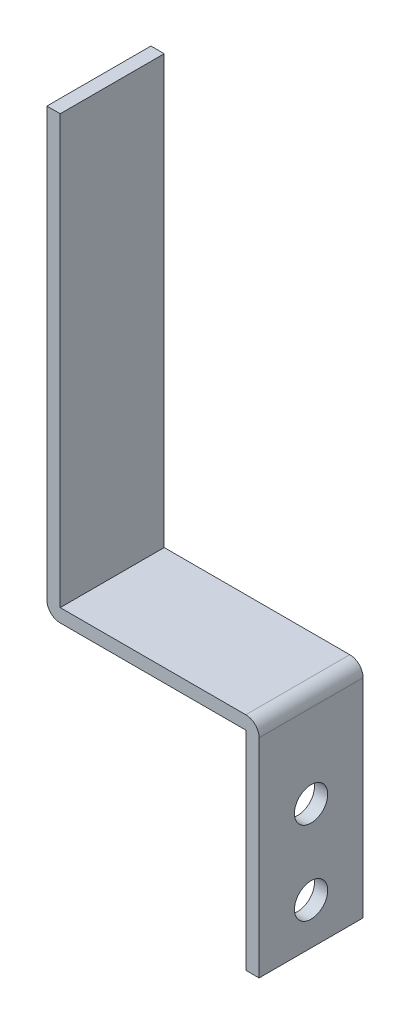
ISO-10303-21;
HEADER;
FILE_DESCRIPTION(('STEP AP214'),'2;1');
FILE_NAME('part.step','',(''),(''),'','','');
FILE_SCHEMA(('AUTOMOTIVE_DESIGN { 1 0 10303 214 1 1 1 1 }'));
ENDSEC;
DATA;
#1=APPLICATION_CONTEXT('core data for automotive mechanical design processes');
#2=APPLICATION_PROTOCOL_DEFINITION('international standard','automotive_design',2000,#1);
#3=PRODUCT_CONTEXT('',#1,'mechanical');
#4=PRODUCT('Part','Part','',(#3));
#5=PRODUCT_RELATED_PRODUCT_CATEGORY('part','',(#4));
#6=PRODUCT_DEFINITION_FORMATION('','',#4);
#7=PRODUCT_DEFINITION_CONTEXT('part definition',#1,'design');
#8=PRODUCT_DEFINITION('design','',#6,#7);
#9=PRODUCT_DEFINITION_SHAPE('','',#8);
#10=(LENGTH_UNIT() NAMED_UNIT(*) SI_UNIT(.MILLI.,.METRE.));
#11=(NAMED_UNIT(*) PLANE_ANGLE_UNIT() SI_UNIT($,.RADIAN.));
#12=(NAMED_UNIT(*) SI_UNIT($,.STERADIAN.) SOLID_ANGLE_UNIT());
#13=UNCERTAINTY_MEASURE_WITH_UNIT(LENGTH_MEASURE(1.E-05),#10,'distance_accuracy_value','');
#14=(GEOMETRIC_REPRESENTATION_CONTEXT(3) GLOBAL_UNCERTAINTY_ASSIGNED_CONTEXT((#13)) GLOBAL_UNIT_ASSIGNED_CONTEXT((#10,
#11,#12)) REPRESENTATION_CONTEXT('',''));
#15=CARTESIAN_POINT('',(0.,0.,0.));
#16=DIRECTION('',(0.,0.,1.));
#17=DIRECTION('',(1.,0.,0.));
#18=AXIS2_PLACEMENT_3D('',#15,#16,#17);
#19=CARTESIAN_POINT('',(3.2,156.,25.));
#20=DIRECTION('',(0.,-1.,0.));
#21=DIRECTION('',(0.,0.,-1.));
#22=AXIS2_PLACEMENT_3D('',#19,#20,#21);
#23=PLANE('',#22);
#24=DIRECTION('',(-1.,0.,0.));
#25=VECTOR('',#24,1.);
#26=CARTESIAN_POINT('',(3.2,156.,0.));
#27=LINE('',#26,#25);
#28=CARTESIAN_POINT('',(3.2,156.,0.));
#29=VERTEX_POINT('',#28);
#30=CARTESIAN_POINT('',(0.,156.,0.));
#31=VERTEX_POINT('',#30);
#32=EDGE_CURVE('E147',#29,#31,#27,.T.);
#33=ORIENTED_EDGE('',*,*,#32,.T.);
#34=DIRECTION('',(0.,0.,-1.));
#35=VECTOR('',#34,1.);
#36=CARTESIAN_POINT('',(0.,156.,25.));
#37=LINE('',#36,#35);
#38=CARTESIAN_POINT('',(0.,156.,25.));
#39=VERTEX_POINT('',#38);
#40=EDGE_CURVE('E11',#39,#31,#37,.T.);
#41=ORIENTED_EDGE('',*,*,#40,.F.);
#42=DIRECTION('',(-1.,0.,0.));
#43=VECTOR('',#42,1.);
#44=CARTESIAN_POINT('',(3.2,156.,25.));
#45=LINE('',#44,#43);
#46=CARTESIAN_POINT('',(3.2,156.,25.));
#47=VERTEX_POINT('',#46);
#48=EDGE_CURVE('E166',#47,#39,#45,.T.);
#49=ORIENTED_EDGE('',*,*,#48,.F.);
#50=DIRECTION('',(0.,0.,-1.));
#51=VECTOR('',#50,1.);
#52=CARTESIAN_POINT('',(3.2,156.,25.));
#53=LINE('',#52,#51);
#54=EDGE_CURVE('E143',#47,#29,#53,.T.);
#55=ORIENTED_EDGE('',*,*,#54,.T.);
#56=EDGE_LOOP('',(#33,#41,#49,#55));
#57=FACE_BOUND('',#56,.T.);
#58=ADVANCED_FACE('F39',(#57),#23,.F.);
#59=CARTESIAN_POINT('',(0.,156.,25.));
#60=DIRECTION('',(1.,0.,0.));
#61=DIRECTION('',(0.,0.,-1.));
#62=AXIS2_PLACEMENT_3D('',#59,#60,#61);
#63=PLANE('',#62);
#64=DIRECTION('',(0.,-1.,0.));
#65=VECTOR('',#64,1.);
#66=CARTESIAN_POINT('',(0.,156.,0.));
#67=LINE('',#66,#65);
#68=CARTESIAN_POINT('',(0.,53.2,0.));
#69=VERTEX_POINT('',#68);
#70=EDGE_CURVE('E150',#31,#69,#67,.T.);
#71=ORIENTED_EDGE('',*,*,#70,.T.);
#72=DIRECTION('',(0.,0.,-1.));
#73=VECTOR('',#72,1.);
#74=CARTESIAN_POINT('',(0.,53.2,25.));
#75=LINE('',#74,#73);
#76=CARTESIAN_POINT('',(0.,53.2,25.));
#77=VERTEX_POINT('',#76);
#78=EDGE_CURVE('E47',#77,#69,#75,.T.);
#79=ORIENTED_EDGE('',*,*,#78,.F.);
#80=DIRECTION('',(0.,-1.,0.));
#81=VECTOR('',#80,1.);
#82=CARTESIAN_POINT('',(0.,156.,25.));
#83=LINE('',#82,#81);
#84=EDGE_CURVE('E104',#39,#77,#83,.T.);
#85=ORIENTED_EDGE('',*,*,#84,.F.);
#86=ORIENTED_EDGE('',*,*,#40,.T.);
#87=EDGE_LOOP('',(#71,#79,#85,#86));
#88=FACE_BOUND('',#87,.T.);
#89=ADVANCED_FACE('F251',(#88),#63,.F.);
#90=CARTESIAN_POINT('',(3.2,53.2,25.));
#91=DIRECTION('',(0.,0.,-1.));
#92=DIRECTION('',(-1.,0.,0.));
#93=AXIS2_PLACEMENT_3D('',#90,#91,#92);
#94=CYLINDRICAL_SURFACE('',#93,3.2);
#95=CARTESIAN_POINT('',(3.2,53.2,0.));
#96=DIRECTION('',(0.,0.,1.));
#97=DIRECTION('',(1.,0.,0.));
#98=AXIS2_PLACEMENT_3D('',#95,#96,#97);
#99=CIRCLE('',#98,3.2);
#100=CARTESIAN_POINT('',(3.20000000000002,50.,0.));
#101=VERTEX_POINT('',#100);
#102=EDGE_CURVE('E153',#69,#101,#99,.T.);
#103=ORIENTED_EDGE('',*,*,#102,.T.);
#104=DIRECTION('',(0.,0.,-1.));
#105=VECTOR('',#104,1.);
#106=CARTESIAN_POINT('',(3.20000000000002,50.,25.));
#107=LINE('',#106,#105);
#108=CARTESIAN_POINT('',(3.20000000000002,50.,25.));
#109=VERTEX_POINT('',#108);
#110=EDGE_CURVE('E179',#109,#101,#107,.T.);
#111=ORIENTED_EDGE('',*,*,#110,.F.);
#112=CARTESIAN_POINT('',(3.2,53.2,25.));
#113=DIRECTION('',(0.,0.,1.));
#114=DIRECTION('',(1.,0.,0.));
#115=AXIS2_PLACEMENT_3D('',#112,#113,#114);
#116=CIRCLE('',#115,3.2);
#117=EDGE_CURVE('E187',#77,#109,#116,.T.);
#118=ORIENTED_EDGE('',*,*,#117,.F.);
#119=ORIENTED_EDGE('',*,*,#78,.T.);
#120=EDGE_LOOP('',(#103,#111,#118,#119));
#121=FACE_BOUND('',#120,.T.);
#122=ADVANCED_FACE('F185',(#121),#94,.T.);
#123=CARTESIAN_POINT('',(3.20000000000002,50.,25.));
#124=DIRECTION('',(0.,1.,0.));
#125=DIRECTION('',(0.,0.,1.));
#126=AXIS2_PLACEMENT_3D('',#123,#124,#125);
#127=PLANE('',#126);
#128=DIRECTION('',(1.,0.,0.));
#129=VECTOR('',#128,1.);
#130=CARTESIAN_POINT('',(3.20000000000002,50.,0.));
#131=LINE('',#130,#129);
#132=CARTESIAN_POINT('',(47.8,50.,0.));
#133=VERTEX_POINT('',#132);
#134=EDGE_CURVE('E155',#101,#133,#131,.T.);
#135=ORIENTED_EDGE('',*,*,#134,.T.);
#136=DIRECTION('',(0.,0.,-1.));
#137=VECTOR('',#136,1.);
#138=CARTESIAN_POINT('',(47.8,50.,25.));
#139=LINE('',#138,#137);
#140=CARTESIAN_POINT('',(47.8,50.,25.));
#141=VERTEX_POINT('',#140);
#142=EDGE_CURVE('E176',#141,#133,#139,.T.);
#143=ORIENTED_EDGE('',*,*,#142,.F.);
#144=DIRECTION('',(1.,0.,0.));
#145=VECTOR('',#144,1.);
#146=CARTESIAN_POINT('',(3.20000000000002,50.,25.));
#147=LINE('',#146,#145);
#148=EDGE_CURVE('E205',#109,#141,#147,.T.);
#149=ORIENTED_EDGE('',*,*,#148,.F.);
#150=ORIENTED_EDGE('',*,*,#110,.T.);
#151=EDGE_LOOP('',(#135,#143,#149,#150));
#152=FACE_BOUND('',#151,.T.);
#153=ADVANCED_FACE('F196',(#152),#127,.F.);
#154=CARTESIAN_POINT('',(47.8,50.,25.));
#155=DIRECTION('',(1.,0.,0.));
#156=DIRECTION('',(0.,0.,-1.));
#157=AXIS2_PLACEMENT_3D('',#154,#155,#156);
#158=PLANE('',#157);
#159=CARTESIAN_POINT('',(47.8,10.,12.5));
#160=DIRECTION('',(1.,0.,0.));
#161=DIRECTION('',(0.,0.,-1.));
#162=AXIS2_PLACEMENT_3D('',#159,#160,#161);
#163=CIRCLE('',#162,4.);
#164=CARTESIAN_POINT('',(47.8,10.,8.5));
#165=VERTEX_POINT('',#164);
#166=EDGE_CURVE('E151',#165,#165,#163,.T.);
#167=ORIENTED_EDGE('',*,*,#166,.T.);
#168=EDGE_LOOP('',(#167));
#169=FACE_BOUND('',#168,.T.);
#170=CARTESIAN_POINT('',(47.8,30.,12.5));
#171=DIRECTION('',(1.,0.,0.));
#172=DIRECTION('',(0.,0.,-1.));
#173=AXIS2_PLACEMENT_3D('',#170,#171,#172);
#174=CIRCLE('',#173,4.);
#175=CARTESIAN_POINT('',(47.8,30.,8.5));
#176=VERTEX_POINT('',#175);
#177=EDGE_CURVE('E215',#176,#176,#174,.T.);
#178=ORIENTED_EDGE('',*,*,#177,.T.);
#179=EDGE_LOOP('',(#178));
#180=FACE_BOUND('',#179,.T.);
#181=DIRECTION('',(0.,-1.,0.));
#182=VECTOR('',#181,1.);
#183=CARTESIAN_POINT('',(47.8,50.,0.));
#184=LINE('',#183,#182);
#185=CARTESIAN_POINT('',(47.8,0.,0.));
#186=VERTEX_POINT('',#185);
#187=EDGE_CURVE('E157',#133,#186,#184,.T.);
#188=ORIENTED_EDGE('',*,*,#187,.T.);
#189=DIRECTION('',(0.,0.,-1.));
#190=VECTOR('',#189,1.);
#191=CARTESIAN_POINT('',(47.8,0.,25.));
#192=LINE('',#191,#190);
#193=CARTESIAN_POINT('',(47.8,0.,25.));
#194=VERTEX_POINT('',#193);
#195=EDGE_CURVE('E173',#194,#186,#192,.T.);
#196=ORIENTED_EDGE('',*,*,#195,.F.);
#197=DIRECTION('',(0.,-1.,0.));
#198=VECTOR('',#197,1.);
#199=CARTESIAN_POINT('',(47.8,50.,25.));
#200=LINE('',#199,#198);
#201=EDGE_CURVE('E202',#141,#194,#200,.T.);
#202=ORIENTED_EDGE('',*,*,#201,.F.);
#203=ORIENTED_EDGE('',*,*,#142,.T.);
#204=EDGE_LOOP('',(#188,#196,#202,#203));
#205=FACE_BOUND('',#204,.T.);
#206=ADVANCED_FACE('F200',(#169,#180,#205),#158,.F.);
#207=CARTESIAN_POINT('',(47.8,0.,25.));
#208=DIRECTION('',(0.,1.,0.));
#209=DIRECTION('',(0.,0.,1.));
#210=AXIS2_PLACEMENT_3D('',#207,#208,#209);
#211=PLANE('',#210);
#212=DIRECTION('',(1.,0.,0.));
#213=VECTOR('',#212,1.);
#214=CARTESIAN_POINT('',(47.8,0.,0.));
#215=LINE('',#214,#213);
#216=CARTESIAN_POINT('',(51.,0.,0.));
#217=VERTEX_POINT('',#216);
#218=EDGE_CURVE('E159',#186,#217,#215,.T.);
#219=ORIENTED_EDGE('',*,*,#218,.T.);
#220=DIRECTION('',(0.,0.,-1.));
#221=VECTOR('',#220,1.);
#222=CARTESIAN_POINT('',(51.,0.,25.));
#223=LINE('',#222,#221);
#224=CARTESIAN_POINT('',(51.,0.,25.));
#225=VERTEX_POINT('',#224);
#226=EDGE_CURVE('E170',#225,#217,#223,.T.);
#227=ORIENTED_EDGE('',*,*,#226,.F.);
#228=DIRECTION('',(1.,0.,0.));
#229=VECTOR('',#228,1.);
#230=CARTESIAN_POINT('',(47.8,0.,25.));
#231=LINE('',#230,#229);
#232=EDGE_CURVE('E204',#194,#225,#231,.T.);
#233=ORIENTED_EDGE('',*,*,#232,.F.);
#234=ORIENTED_EDGE('',*,*,#195,.T.);
#235=EDGE_LOOP('',(#219,#227,#233,#234));
#236=FACE_BOUND('',#235,.T.);
#237=ADVANCED_FACE('F231',(#236),#211,.F.);
#238=CARTESIAN_POINT('',(51.,0.,25.));
#239=DIRECTION('',(-1.,0.,0.));
#240=DIRECTION('',(0.,0.,1.));
#241=AXIS2_PLACEMENT_3D('',#238,#239,#240);
#242=PLANE('',#241);
#243=CARTESIAN_POINT('',(51.,10.,12.5));
#244=DIRECTION('',(1.,0.,0.));
#245=DIRECTION('',(0.,0.,-1.));
#246=AXIS2_PLACEMENT_3D('',#243,#244,#245);
#247=CIRCLE('',#246,4.);
#248=CARTESIAN_POINT('',(51.,10.,8.5));
#249=VERTEX_POINT('',#248);
#250=EDGE_CURVE('E218',#249,#249,#247,.T.);
#251=ORIENTED_EDGE('',*,*,#250,.F.);
#252=EDGE_LOOP('',(#251));
#253=FACE_BOUND('',#252,.T.);
#254=CARTESIAN_POINT('',(51.,30.,12.5));
#255=DIRECTION('',(1.,0.,0.));
#256=DIRECTION('',(0.,0.,-1.));
#257=AXIS2_PLACEMENT_3D('',#254,#255,#256);
#258=CIRCLE('',#257,4.);
#259=CARTESIAN_POINT('',(51.,30.,8.5));
#260=VERTEX_POINT('',#259);
#261=EDGE_CURVE('E219',#260,#260,#258,.T.);
#262=ORIENTED_EDGE('',*,*,#261,.F.);
#263=EDGE_LOOP('',(#262));
#264=FACE_BOUND('',#263,.T.);
#265=DIRECTION('',(0.,1.,0.));
#266=VECTOR('',#265,1.);
#267=CARTESIAN_POINT('',(51.,0.,0.));
#268=LINE('',#267,#266);
#269=CARTESIAN_POINT('',(51.,50.,0.));
#270=VERTEX_POINT('',#269);
#271=EDGE_CURVE('E161',#217,#270,#268,.T.);
#272=ORIENTED_EDGE('',*,*,#271,.T.);
#273=DIRECTION('',(0.,0.,-1.));
#274=VECTOR('',#273,1.);
#275=CARTESIAN_POINT('',(51.,50.,25.));
#276=LINE('',#275,#274);
#277=CARTESIAN_POINT('',(51.,50.,25.));
#278=VERTEX_POINT('',#277);
#279=EDGE_CURVE('E138',#278,#270,#276,.T.);
#280=ORIENTED_EDGE('',*,*,#279,.F.);
#281=DIRECTION('',(0.,1.,0.));
#282=VECTOR('',#281,1.);
#283=CARTESIAN_POINT('',(51.,0.,25.));
#284=LINE('',#283,#282);
#285=EDGE_CURVE('E129',#225,#278,#284,.T.);
#286=ORIENTED_EDGE('',*,*,#285,.F.);
#287=ORIENTED_EDGE('',*,*,#226,.T.);
#288=EDGE_LOOP('',(#272,#280,#286,#287));
#289=FACE_BOUND('',#288,.T.);
#290=ADVANCED_FACE('F228',(#253,#264,#289),#242,.F.);
#291=CARTESIAN_POINT('',(47.8,50.,25.));
#292=DIRECTION('',(0.,0.,-1.));
#293=DIRECTION('',(-1.,0.,0.));
#294=AXIS2_PLACEMENT_3D('',#291,#292,#293);
#295=CYLINDRICAL_SURFACE('',#294,3.2);
#296=CARTESIAN_POINT('',(47.8,50.,0.));
#297=DIRECTION('',(0.,0.,1.));
#298=DIRECTION('',(1.,0.,0.));
#299=AXIS2_PLACEMENT_3D('',#296,#297,#298);
#300=CIRCLE('',#299,3.2);
#301=CARTESIAN_POINT('',(47.8,53.2,0.));
#302=VERTEX_POINT('',#301);
#303=EDGE_CURVE('E137',#270,#302,#300,.T.);
#304=ORIENTED_EDGE('',*,*,#303,.T.);
#305=DIRECTION('',(0.,0.,-1.));
#306=VECTOR('',#305,1.);
#307=CARTESIAN_POINT('',(47.8,53.2,25.));
#308=LINE('',#307,#306);
#309=CARTESIAN_POINT('',(47.8,53.2,25.));
#310=VERTEX_POINT('',#309);
#311=EDGE_CURVE('E134',#310,#302,#308,.T.);
#312=ORIENTED_EDGE('',*,*,#311,.F.);
#313=CARTESIAN_POINT('',(47.8,50.,25.));
#314=DIRECTION('',(0.,0.,1.));
#315=DIRECTION('',(1.,0.,0.));
#316=AXIS2_PLACEMENT_3D('',#313,#314,#315);
#317=CIRCLE('',#316,3.2);
#318=EDGE_CURVE('E123',#278,#310,#317,.T.);
#319=ORIENTED_EDGE('',*,*,#318,.F.);
#320=ORIENTED_EDGE('',*,*,#279,.T.);
#321=EDGE_LOOP('',(#304,#312,#319,#320));
#322=FACE_BOUND('',#321,.T.);
#323=ADVANCED_FACE('F135',(#322),#295,.T.);
#324=CARTESIAN_POINT('',(47.8,53.2,25.));
#325=DIRECTION('',(0.,-1.,0.));
#326=DIRECTION('',(0.,0.,-1.));
#327=AXIS2_PLACEMENT_3D('',#324,#325,#326);
#328=PLANE('',#327);
#329=DIRECTION('',(-1.,0.,0.));
#330=VECTOR('',#329,1.);
#331=CARTESIAN_POINT('',(47.8,53.2,0.));
#332=LINE('',#331,#330);
#333=CARTESIAN_POINT('',(3.2,53.2,0.));
#334=VERTEX_POINT('',#333);
#335=EDGE_CURVE('E90',#302,#334,#332,.T.);
#336=ORIENTED_EDGE('',*,*,#335,.T.);
#337=DIRECTION('',(0.,0.,-1.));
#338=VECTOR('',#337,1.);
#339=CARTESIAN_POINT('',(3.2,53.2,25.));
#340=LINE('',#339,#338);
#341=CARTESIAN_POINT('',(3.2,53.2,25.));
#342=VERTEX_POINT('',#341);
#343=EDGE_CURVE('E139',#342,#334,#340,.T.);
#344=ORIENTED_EDGE('',*,*,#343,.F.);
#345=DIRECTION('',(-1.,0.,0.));
#346=VECTOR('',#345,1.);
#347=CARTESIAN_POINT('',(47.8,53.2,25.));
#348=LINE('',#347,#346);
#349=EDGE_CURVE('E127',#310,#342,#348,.T.);
#350=ORIENTED_EDGE('',*,*,#349,.F.);
#351=ORIENTED_EDGE('',*,*,#311,.T.);
#352=EDGE_LOOP('',(#336,#344,#350,#351));
#353=FACE_BOUND('',#352,.T.);
#354=ADVANCED_FACE('F141',(#353),#328,.F.);
#355=CARTESIAN_POINT('',(3.2,53.2,25.));
#356=DIRECTION('',(-1.,0.,0.));
#357=DIRECTION('',(0.,0.,1.));
#358=AXIS2_PLACEMENT_3D('',#355,#356,#357);
#359=PLANE('',#358);
#360=DIRECTION('',(0.,1.,0.));
#361=VECTOR('',#360,1.);
#362=CARTESIAN_POINT('',(3.2,53.2,0.));
#363=LINE('',#362,#361);
#364=EDGE_CURVE('E96',#334,#29,#363,.T.);
#365=ORIENTED_EDGE('',*,*,#364,.T.);
#366=ORIENTED_EDGE('',*,*,#54,.F.);
#367=DIRECTION('',(0.,1.,0.));
#368=VECTOR('',#367,1.);
#369=CARTESIAN_POINT('',(3.2,53.2,25.));
#370=LINE('',#369,#368);
#371=EDGE_CURVE('E55',#342,#47,#370,.T.);
#372=ORIENTED_EDGE('',*,*,#371,.F.);
#373=ORIENTED_EDGE('',*,*,#343,.T.);
#374=EDGE_LOOP('',(#365,#366,#372,#373));
#375=FACE_BOUND('',#374,.T.);
#376=ADVANCED_FACE('F240',(#375),#359,.F.);
#377=CARTESIAN_POINT('',(3.2,53.2,25.));
#378=DIRECTION('',(0.,0.,1.));
#379=DIRECTION('',(1.,0.,0.));
#380=AXIS2_PLACEMENT_3D('',#377,#378,#379);
#381=PLANE('',#380);
#382=ORIENTED_EDGE('',*,*,#48,.T.);
#383=ORIENTED_EDGE('',*,*,#84,.T.);
#384=ORIENTED_EDGE('',*,*,#117,.T.);
#385=ORIENTED_EDGE('',*,*,#148,.T.);
#386=ORIENTED_EDGE('',*,*,#201,.T.);
#387=ORIENTED_EDGE('',*,*,#232,.T.);
#388=ORIENTED_EDGE('',*,*,#285,.T.);
#389=ORIENTED_EDGE('',*,*,#318,.T.);
#390=ORIENTED_EDGE('',*,*,#349,.T.);
#391=ORIENTED_EDGE('',*,*,#371,.T.);
#392=EDGE_LOOP('',(#382,#383,#384,#385,#386,#387,#388,#389,#390,#391));
#393=FACE_BOUND('',#392,.T.);
#394=ADVANCED_FACE('F125',(#393),#381,.T.);
#395=CARTESIAN_POINT('',(3.2,53.2,0.));
#396=DIRECTION('',(0.,0.,1.));
#397=DIRECTION('',(1.,0.,0.));
#398=AXIS2_PLACEMENT_3D('',#395,#396,#397);
#399=PLANE('',#398);
#400=ORIENTED_EDGE('',*,*,#32,.F.);
#401=ORIENTED_EDGE('',*,*,#364,.F.);
#402=ORIENTED_EDGE('',*,*,#335,.F.);
#403=ORIENTED_EDGE('',*,*,#303,.F.);
#404=ORIENTED_EDGE('',*,*,#271,.F.);
#405=ORIENTED_EDGE('',*,*,#218,.F.);
#406=ORIENTED_EDGE('',*,*,#187,.F.);
#407=ORIENTED_EDGE('',*,*,#134,.F.);
#408=ORIENTED_EDGE('',*,*,#102,.F.);
#409=ORIENTED_EDGE('',*,*,#70,.F.);
#410=EDGE_LOOP('',(#400,#401,#402,#403,#404,#405,#406,#407,#408,#409));
#411=FACE_BOUND('',#410,.T.);
#412=ADVANCED_FACE('F191',(#411),#399,.F.);
#413=CARTESIAN_POINT('',(-1.2E-05,30.,12.5));
#414=DIRECTION('',(1.,0.,0.));
#415=DIRECTION('',(0.,0.,-1.));
#416=AXIS2_PLACEMENT_3D('',#413,#414,#415);
#417=CYLINDRICAL_SURFACE('',#416,4.);
#418=CARTESIAN_POINT('',(51.,30.,8.5));
#419=CARTESIAN_POINT('',(50.9666666666667,30.,8.5));
#420=CARTESIAN_POINT('',(50.9333333333333,30.,8.5));
#421=CARTESIAN_POINT('',(50.8666666666667,30.,8.5));
#422=CARTESIAN_POINT('',(50.8333333333333,30.,8.5));
#423=CARTESIAN_POINT('',(50.7666666666667,30.,8.5));
#424=CARTESIAN_POINT('',(50.7333333333333,30.,8.5));
#425=CARTESIAN_POINT('',(50.6666666666667,30.,8.5));
#426=CARTESIAN_POINT('',(50.6333333333333,30.,8.5));
#427=CARTESIAN_POINT('',(50.5666666666667,30.,8.5));
#428=CARTESIAN_POINT('',(50.5333333333333,30.,8.5));
#429=CARTESIAN_POINT('',(50.4666666666667,30.,8.5));
#430=CARTESIAN_POINT('',(50.4333333333333,30.,8.5));
#431=CARTESIAN_POINT('',(50.3666666666667,30.,8.5));
#432=CARTESIAN_POINT('',(50.3333333333333,30.,8.5));
#433=CARTESIAN_POINT('',(50.2666666666667,30.,8.5));
#434=CARTESIAN_POINT('',(50.2333333333333,30.,8.5));
#435=CARTESIAN_POINT('',(50.1666666666667,30.,8.5));
#436=CARTESIAN_POINT('',(50.1333333333333,30.,8.5));
#437=CARTESIAN_POINT('',(50.0666666666667,30.,8.5));
#438=CARTESIAN_POINT('',(50.0333333333333,30.,8.5));
#439=CARTESIAN_POINT('',(49.9666666666667,30.,8.5));
#440=CARTESIAN_POINT('',(49.9333333333333,30.,8.5));
#441=CARTESIAN_POINT('',(49.8666666666667,30.,8.5));
#442=CARTESIAN_POINT('',(49.8333333333333,30.,8.5));
#443=CARTESIAN_POINT('',(49.7666666666667,30.,8.5));
#444=CARTESIAN_POINT('',(49.7333333333333,30.,8.5));
#445=CARTESIAN_POINT('',(49.6666666666667,30.,8.5));
#446=CARTESIAN_POINT('',(49.6333333333333,30.,8.5));
#447=CARTESIAN_POINT('',(49.5666666666667,30.,8.5));
#448=CARTESIAN_POINT('',(49.5333333333333,30.,8.5));
#449=CARTESIAN_POINT('',(49.4666666666667,30.,8.5));
#450=CARTESIAN_POINT('',(49.4333333333333,30.,8.5));
#451=CARTESIAN_POINT('',(49.3666666666667,30.,8.5));
#452=CARTESIAN_POINT('',(49.3333333333333,30.,8.5));
#453=CARTESIAN_POINT('',(49.2666666666667,30.,8.5));
#454=CARTESIAN_POINT('',(49.2333333333333,30.,8.5));
#455=CARTESIAN_POINT('',(49.1666666666667,30.,8.5));
#456=CARTESIAN_POINT('',(49.1333333333333,30.,8.5));
#457=CARTESIAN_POINT('',(49.0666666666667,30.,8.5));
#458=CARTESIAN_POINT('',(49.0333333333333,30.,8.5));
#459=CARTESIAN_POINT('',(48.9666666666667,30.,8.5));
#460=CARTESIAN_POINT('',(48.9333333333333,30.,8.5));
#461=CARTESIAN_POINT('',(48.8666666666667,30.,8.5));
#462=CARTESIAN_POINT('',(48.8333333333333,30.,8.5));
#463=CARTESIAN_POINT('',(48.7666666666667,30.,8.5));
#464=CARTESIAN_POINT('',(48.7333333333333,30.,8.5));
#465=CARTESIAN_POINT('',(48.6666666666667,30.,8.5));
#466=CARTESIAN_POINT('',(48.6333333333333,30.,8.5));
#467=CARTESIAN_POINT('',(48.5666666666667,30.,8.5));
#468=CARTESIAN_POINT('',(48.5333333333333,30.,8.5));
#469=CARTESIAN_POINT('',(48.4666666666667,30.,8.5));
#470=CARTESIAN_POINT('',(48.4333333333333,30.,8.5));
#471=CARTESIAN_POINT('',(48.3666666666667,30.,8.5));
#472=CARTESIAN_POINT('',(48.3333333333333,30.,8.5));
#473=CARTESIAN_POINT('',(48.2666666666667,30.,8.5));
#474=CARTESIAN_POINT('',(48.2333333333333,30.,8.5));
#475=CARTESIAN_POINT('',(48.1666666666667,30.,8.5));
#476=CARTESIAN_POINT('',(48.1333333333333,30.,8.5));
#477=CARTESIAN_POINT('',(48.0666666666667,30.,8.5));
#478=CARTESIAN_POINT('',(48.0333333333333,30.,8.5));
#479=CARTESIAN_POINT('',(47.9666666666667,30.,8.5));
#480=CARTESIAN_POINT('',(47.9333333333333,30.,8.5));
#481=CARTESIAN_POINT('',(47.8666666666667,30.,8.5));
#482=CARTESIAN_POINT('',(47.8333333333333,30.,8.5));
#483=CARTESIAN_POINT('',(47.8,30.,8.5));
#484=B_SPLINE_CURVE_WITH_KNOTS('',3,(#418,#419,#420,#421,#422,#423,#424,#425,#426,#427,#428,
#429,#430,#431,#432,#433,#434,#435,#436,#437,#438,#439,#440,#441,#442,#443,#444,#445,#446,#447,
#448,#449,#450,#451,#452,#453,#454,#455,#456,#457,#458,#459,#460,#461,#462,#463,#464,#465,#466,
#467,#468,#469,#470,#471,#472,#473,#474,#475,#476,#477,#478,#479,#480,#481,#482,#483),
.UNSPECIFIED.,.F.,.F.,(4,2,2,2,2,2,2,2,2,2,2,2,2,2,2,2,2,2,2,2,2,2,2,2,2,2,2,2,2,2,2,2,4),(0.,
0.100000000000003,0.199999999999999,0.300000000000002,0.399999999999998,0.5,0.599999999999996,
0.699999999999999,0.799999999999995,0.899999999999998,1.,1.1,1.2,1.3,1.4,1.49999999999999,1.6,
1.7,1.8,1.9,1.99999999999999,2.1,2.19999999999999,2.3,2.4,2.5,2.6,2.69999999999999,2.8,
2.89999999999999,3.,3.09999999999999,3.19999999999999),.UNSPECIFIED.);
#485=EDGE_CURVE('BSEAM300',#260,#176,#484,.T.);
#486=ORIENTED_EDGE('',*,*,#261,.T.);
#487=ORIENTED_EDGE('',*,*,#177,.F.);
#488=ORIENTED_EDGE('',*,*,#485,.T.);
#489=ORIENTED_EDGE('',*,*,#485,.F.);
#490=EDGE_LOOP('',(#486,#488,#487,#489));
#491=FACE_BOUND('',#490,.T.);
#492=ADVANCED_FACE('F300',(#491),#417,.F.);
#493=CARTESIAN_POINT('',(-1.2E-05,10.,12.5));
#494=DIRECTION('',(1.,0.,0.));
#495=DIRECTION('',(0.,0.,-1.));
#496=AXIS2_PLACEMENT_3D('',#493,#494,#495);
#497=CYLINDRICAL_SURFACE('',#496,4.);
#498=CARTESIAN_POINT('',(51.,10.,8.5));
#499=CARTESIAN_POINT('',(50.9666666666667,10.,8.5));
#500=CARTESIAN_POINT('',(50.9333333333333,10.,8.5));
#501=CARTESIAN_POINT('',(50.8666666666667,10.,8.5));
#502=CARTESIAN_POINT('',(50.8333333333333,10.,8.5));
#503=CARTESIAN_POINT('',(50.7666666666667,10.,8.5));
#504=CARTESIAN_POINT('',(50.7333333333333,10.,8.5));
#505=CARTESIAN_POINT('',(50.6666666666667,10.,8.5));
#506=CARTESIAN_POINT('',(50.6333333333333,10.,8.5));
#507=CARTESIAN_POINT('',(50.5666666666667,10.,8.5));
#508=CARTESIAN_POINT('',(50.5333333333333,10.,8.5));
#509=CARTESIAN_POINT('',(50.4666666666667,10.,8.5));
#510=CARTESIAN_POINT('',(50.4333333333333,10.,8.5));
#511=CARTESIAN_POINT('',(50.3666666666667,10.,8.5));
#512=CARTESIAN_POINT('',(50.3333333333333,10.,8.5));
#513=CARTESIAN_POINT('',(50.2666666666667,10.,8.5));
#514=CARTESIAN_POINT('',(50.2333333333333,10.,8.5));
#515=CARTESIAN_POINT('',(50.1666666666667,10.,8.5));
#516=CARTESIAN_POINT('',(50.1333333333333,10.,8.5));
#517=CARTESIAN_POINT('',(50.0666666666667,10.,8.5));
#518=CARTESIAN_POINT('',(50.0333333333333,10.,8.5));
#519=CARTESIAN_POINT('',(49.9666666666667,10.,8.5));
#520=CARTESIAN_POINT('',(49.9333333333333,10.,8.5));
#521=CARTESIAN_POINT('',(49.8666666666667,10.,8.5));
#522=CARTESIAN_POINT('',(49.8333333333333,10.,8.5));
#523=CARTESIAN_POINT('',(49.7666666666667,10.,8.5));
#524=CARTESIAN_POINT('',(49.7333333333333,10.,8.5));
#525=CARTESIAN_POINT('',(49.6666666666667,10.,8.5));
#526=CARTESIAN_POINT('',(49.6333333333333,10.,8.5));
#527=CARTESIAN_POINT('',(49.5666666666667,10.,8.5));
#528=CARTESIAN_POINT('',(49.5333333333333,10.,8.5));
#529=CARTESIAN_POINT('',(49.4666666666667,10.,8.5));
#530=CARTESIAN_POINT('',(49.4333333333333,10.,8.5));
#531=CARTESIAN_POINT('',(49.3666666666667,10.,8.5));
#532=CARTESIAN_POINT('',(49.3333333333333,10.,8.5));
#533=CARTESIAN_POINT('',(49.2666666666667,10.,8.5));
#534=CARTESIAN_POINT('',(49.2333333333333,10.,8.5));
#535=CARTESIAN_POINT('',(49.1666666666667,10.,8.5));
#536=CARTESIAN_POINT('',(49.1333333333333,10.,8.5));
#537=CARTESIAN_POINT('',(49.0666666666667,10.,8.5));
#538=CARTESIAN_POINT('',(49.0333333333333,10.,8.5));
#539=CARTESIAN_POINT('',(48.9666666666667,10.,8.5));
#540=CARTESIAN_POINT('',(48.9333333333333,10.,8.5));
#541=CARTESIAN_POINT('',(48.8666666666667,10.,8.5));
#542=CARTESIAN_POINT('',(48.8333333333333,10.,8.5));
#543=CARTESIAN_POINT('',(48.7666666666667,10.,8.5));
#544=CARTESIAN_POINT('',(48.7333333333333,10.,8.5));
#545=CARTESIAN_POINT('',(48.6666666666667,10.,8.5));
#546=CARTESIAN_POINT('',(48.6333333333333,10.,8.5));
#547=CARTESIAN_POINT('',(48.5666666666667,10.,8.5));
#548=CARTESIAN_POINT('',(48.5333333333333,10.,8.5));
#549=CARTESIAN_POINT('',(48.4666666666667,10.,8.5));
#550=CARTESIAN_POINT('',(48.4333333333333,10.,8.5));
#551=CARTESIAN_POINT('',(48.3666666666667,10.,8.5));
#552=CARTESIAN_POINT('',(48.3333333333333,10.,8.5));
#553=CARTESIAN_POINT('',(48.2666666666667,10.,8.5));
#554=CARTESIAN_POINT('',(48.2333333333333,10.,8.5));
#555=CARTESIAN_POINT('',(48.1666666666667,10.,8.5));
#556=CARTESIAN_POINT('',(48.1333333333333,10.,8.5));
#557=CARTESIAN_POINT('',(48.0666666666667,10.,8.5));
#558=CARTESIAN_POINT('',(48.0333333333333,10.,8.5));
#559=CARTESIAN_POINT('',(47.9666666666667,10.,8.5));
#560=CARTESIAN_POINT('',(47.9333333333333,10.,8.5));
#561=CARTESIAN_POINT('',(47.8666666666667,10.,8.5));
#562=CARTESIAN_POINT('',(47.8333333333333,10.,8.5));
#563=CARTESIAN_POINT('',(47.8,10.,8.5));
#564=B_SPLINE_CURVE_WITH_KNOTS('',3,(#498,#499,#500,#501,#502,#503,#504,#505,#506,#507,#508,
#509,#510,#511,#512,#513,#514,#515,#516,#517,#518,#519,#520,#521,#522,#523,#524,#525,#526,#527,
#528,#529,#530,#531,#532,#533,#534,#535,#536,#537,#538,#539,#540,#541,#542,#543,#544,#545,#546,
#547,#548,#549,#550,#551,#552,#553,#554,#555,#556,#557,#558,#559,#560,#561,#562,#563),
.UNSPECIFIED.,.F.,.F.,(4,2,2,2,2,2,2,2,2,2,2,2,2,2,2,2,2,2,2,2,2,2,2,2,2,2,2,2,2,2,2,2,4),(0.,
0.100000000000003,0.199999999999999,0.300000000000002,0.399999999999998,0.5,0.599999999999996,
0.699999999999999,0.799999999999995,0.899999999999998,1.,1.1,1.2,1.3,1.4,1.49999999999999,1.6,
1.7,1.8,1.9,1.99999999999999,2.1,2.19999999999999,2.3,2.4,2.5,2.6,2.69999999999999,2.8,
2.89999999999999,3.,3.09999999999999,3.19999999999999),.UNSPECIFIED.);
#565=EDGE_CURVE('BSEAM225',#249,#165,#564,.T.);
#566=ORIENTED_EDGE('',*,*,#250,.T.);
#567=ORIENTED_EDGE('',*,*,#166,.F.);
#568=ORIENTED_EDGE('',*,*,#565,.T.);
#569=ORIENTED_EDGE('',*,*,#565,.F.);
#570=EDGE_LOOP('',(#566,#568,#567,#569));
#571=FACE_BOUND('',#570,.T.);
#572=ADVANCED_FACE('F225',(#571),#497,.F.);
#573=CLOSED_SHELL('',(#58,#89,#122,#153,#206,#237,#290,#323,#354,#376,#394,#412,#492,#572));
#574=MANIFOLD_SOLID_BREP('B2',#573);
#575=ADVANCED_BREP_SHAPE_REPRESENTATION('',(#18,#574),#14);
#576=SHAPE_DEFINITION_REPRESENTATION(#9,#575);
ENDSEC;
END-ISO-10303-21;
